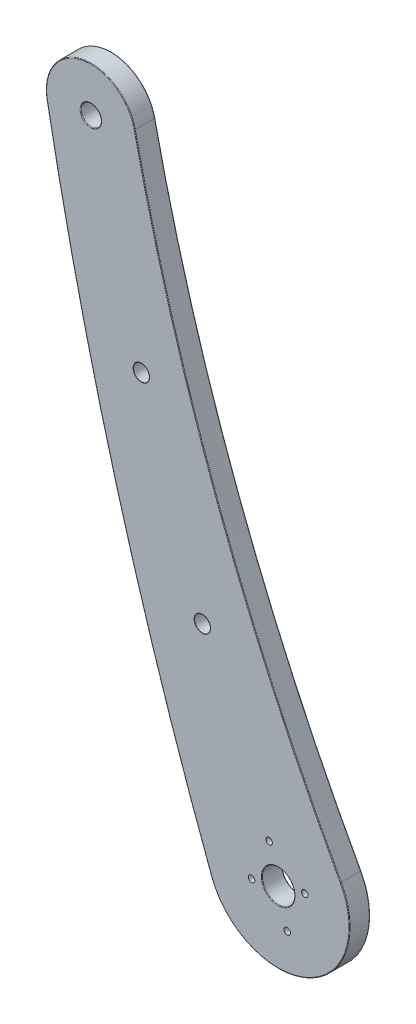
ISO-10303-21;
HEADER;
FILE_DESCRIPTION(('STEP AP214'),'2;1');
FILE_NAME('part.step','',(''),(''),'','','');
FILE_SCHEMA(('AUTOMOTIVE_DESIGN { 1 0 10303 214 1 1 1 1 }'));
ENDSEC;
DATA;
#1=APPLICATION_CONTEXT('core data for automotive mechanical design processes');
#2=APPLICATION_PROTOCOL_DEFINITION('international standard','automotive_design',2000,#1);
#3=PRODUCT_CONTEXT('',#1,'mechanical');
#4=PRODUCT('Part','Part','',(#3));
#5=PRODUCT_RELATED_PRODUCT_CATEGORY('part','',(#4));
#6=PRODUCT_DEFINITION_FORMATION('','',#4);
#7=PRODUCT_DEFINITION_CONTEXT('part definition',#1,'design');
#8=PRODUCT_DEFINITION('design','',#6,#7);
#9=PRODUCT_DEFINITION_SHAPE('','',#8);
#10=(LENGTH_UNIT() NAMED_UNIT(*) SI_UNIT(.MILLI.,.METRE.));
#11=(NAMED_UNIT(*) PLANE_ANGLE_UNIT() SI_UNIT($,.RADIAN.));
#12=(NAMED_UNIT(*) SI_UNIT($,.STERADIAN.) SOLID_ANGLE_UNIT());
#13=UNCERTAINTY_MEASURE_WITH_UNIT(LENGTH_MEASURE(1.E-05),#10,'distance_accuracy_value','');
#14=(GEOMETRIC_REPRESENTATION_CONTEXT(3) GLOBAL_UNCERTAINTY_ASSIGNED_CONTEXT((#13)) GLOBAL_UNIT_ASSIGNED_CONTEXT((#10,
#11,#12)) REPRESENTATION_CONTEXT('',''));
#15=CARTESIAN_POINT('',(0.,0.,0.));
#16=DIRECTION('',(0.,0.,1.));
#17=DIRECTION('',(1.,0.,0.));
#18=AXIS2_PLACEMENT_3D('',#15,#16,#17);
#19=CARTESIAN_POINT('',(-66.1462417472821,198.273924243267,-5.));
#20=DIRECTION('',(0.,0.,1.));
#21=DIRECTION('',(1.,0.,0.));
#22=AXIS2_PLACEMENT_3D('',#19,#20,#21);
#23=CYLINDRICAL_SURFACE('',#22,10.9999999999999);
#24=DIRECTION('',(0.,0.,1.));
#25=VECTOR('',#24,1.);
#26=CARTESIAN_POINT('',(-55.3988805782516,200.617901184795,-5.));
#27=LINE('',#26,#25);
#28=CARTESIAN_POINT('',(-55.3988805782516,200.617901184795,-4.85));
#29=VERTEX_POINT('',#28);
#30=CARTESIAN_POINT('',(-55.3988805782516,200.617901184795,-0.15));
#31=VERTEX_POINT('',#30);
#32=EDGE_CURVE('E110',#29,#31,#27,.T.);
#33=ORIENTED_EDGE('',*,*,#32,.F.);
#34=CARTESIAN_POINT('',(-66.1462417472821,198.273924243267,-4.85));
#35=DIRECTION('',(0.,0.,-1.));
#36=DIRECTION('',(-1.,0.,0.));
#37=AXIS2_PLACEMENT_3D('',#34,#35,#36);
#38=CIRCLE('',#37,10.9999999999999);
#39=CARTESIAN_POINT('',(-76.9621917027425,196.270121218771,-4.85));
#40=VERTEX_POINT('',#39);
#41=EDGE_CURVE('E105',#29,#40,#38,.F.);
#42=ORIENTED_EDGE('',*,*,#41,.T.);
#43=DIRECTION('',(0.,0.,1.));
#44=VECTOR('',#43,1.);
#45=CARTESIAN_POINT('',(-76.9621917027425,196.270121218771,-5.));
#46=LINE('',#45,#44);
#47=CARTESIAN_POINT('',(-76.9621917027425,196.270121218771,-0.15));
#48=VERTEX_POINT('',#47);
#49=EDGE_CURVE('E107',#40,#48,#46,.T.);
#50=ORIENTED_EDGE('',*,*,#49,.T.);
#51=CARTESIAN_POINT('',(-66.1462417472821,198.273924243267,-0.15));
#52=DIRECTION('',(0.,0.,-1.));
#53=DIRECTION('',(-1.,0.,0.));
#54=AXIS2_PLACEMENT_3D('',#51,#52,#53);
#55=CIRCLE('',#54,10.9999999999999);
#56=EDGE_CURVE('E116',#48,#31,#55,.T.);
#57=ORIENTED_EDGE('',*,*,#56,.T.);
#58=EDGE_LOOP('',(#33,#42,#50,#57));
#59=FACE_BOUND('',#58,.T.);
#60=ADVANCED_FACE('F39',(#59),#23,.T.);
#61=CARTESIAN_POINT('',(433.117536195866,307.162307617871,-5.));
#62=DIRECTION('',(0.,0.,1.));
#63=DIRECTION('',(1.,0.,0.));
#64=AXIS2_PLACEMENT_3D('',#61,#62,#63);
#65=CYLINDRICAL_SURFACE('',#64,500.);
#66=DIRECTION('',(0.,0.,1.));
#67=VECTOR('',#66,1.);
#68=CARTESIAN_POINT('',(-4.88974515279694,66.0199814170296,-5.));
#69=LINE('',#68,#67);
#70=CARTESIAN_POINT('',(-4.88974515279694,66.0199814170296,-4.85));
#71=VERTEX_POINT('',#70);
#72=CARTESIAN_POINT('',(-4.88974515279694,66.0199814170296,-0.15));
#73=VERTEX_POINT('',#72);
#74=EDGE_CURVE('E237',#71,#73,#69,.T.);
#75=ORIENTED_EDGE('',*,*,#74,.F.);
#76=CARTESIAN_POINT('',(433.117536195866,307.162307617871,-4.85));
#77=DIRECTION('',(0.,0.,-1.));
#78=DIRECTION('',(-1.,0.,0.));
#79=AXIS2_PLACEMENT_3D('',#76,#77,#78);
#80=CIRCLE('',#79,500.);
#81=EDGE_CURVE('E172',#71,#29,#80,.T.);
#82=ORIENTED_EDGE('',*,*,#81,.T.);
#83=ORIENTED_EDGE('',*,*,#32,.T.);
#84=CARTESIAN_POINT('',(433.117536195866,307.162307617871,-0.15));
#85=DIRECTION('',(0.,0.,-1.));
#86=DIRECTION('',(-1.,0.,0.));
#87=AXIS2_PLACEMENT_3D('',#84,#85,#86);
#88=CIRCLE('',#87,500.);
#89=EDGE_CURVE('E169',#31,#73,#88,.F.);
#90=ORIENTED_EDGE('',*,*,#89,.T.);
#91=EDGE_LOOP('',(#75,#82,#83,#90));
#92=FACE_BOUND('',#91,.T.);
#93=ADVANCED_FACE('F234',(#92),#65,.F.);
#94=CARTESIAN_POINT('',(-20.2199999999999,57.5800000000001,-5.));
#95=DIRECTION('',(0.,0.,1.));
#96=DIRECTION('',(1.,0.,0.));
#97=AXIS2_PLACEMENT_3D('',#94,#95,#96);
#98=CYLINDRICAL_SURFACE('',#97,17.5);
#99=DIRECTION('',(0.,0.,1.));
#100=VECTOR('',#99,1.);
#101=CARTESIAN_POINT('',(-36.5961270744955,51.4097113487317,-5.));
#102=LINE('',#101,#100);
#103=CARTESIAN_POINT('',(-36.5961270744955,51.4097113487317,-4.85));
#104=VERTEX_POINT('',#103);
#105=CARTESIAN_POINT('',(-36.5961270744955,51.4097113487317,-0.15));
#106=VERTEX_POINT('',#105);
#107=EDGE_CURVE('E127',#104,#106,#102,.T.);
#108=ORIENTED_EDGE('',*,*,#107,.F.);
#109=CARTESIAN_POINT('',(-20.2199999999999,57.5800000000001,-4.85));
#110=DIRECTION('',(0.,0.,-1.));
#111=DIRECTION('',(-1.,0.,0.));
#112=AXIS2_PLACEMENT_3D('',#109,#110,#111);
#113=CIRCLE('',#112,17.5);
#114=EDGE_CURVE('E167',#104,#71,#113,.F.);
#115=ORIENTED_EDGE('',*,*,#114,.T.);
#116=ORIENTED_EDGE('',*,*,#74,.T.);
#117=CARTESIAN_POINT('',(-20.2199999999999,57.5800000000001,-0.15));
#118=DIRECTION('',(0.,0.,-1.));
#119=DIRECTION('',(-1.,0.,0.));
#120=AXIS2_PLACEMENT_3D('',#117,#118,#119);
#121=CIRCLE('',#120,17.5);
#122=EDGE_CURVE('E165',#73,#106,#121,.T.);
#123=ORIENTED_EDGE('',*,*,#122,.T.);
#124=EDGE_LOOP('',(#108,#115,#116,#123));
#125=FACE_BOUND('',#124,.T.);
#126=ADVANCED_FACE('F273',(#125),#98,.T.);
#127=CARTESIAN_POINT('',(758.815759401005,351.109445838912,-5.));
#128=DIRECTION('',(0.,0.,1.));
#129=DIRECTION('',(1.,0.,0.));
#130=AXIS2_PLACEMENT_3D('',#127,#128,#129);
#131=CYLINDRICAL_SURFACE('',#130,850.);
#132=ORIENTED_EDGE('',*,*,#49,.F.);
#133=CARTESIAN_POINT('',(758.815759401005,351.109445838912,-4.85));
#134=DIRECTION('',(0.,0.,-1.));
#135=DIRECTION('',(-1.,0.,0.));
#136=AXIS2_PLACEMENT_3D('',#133,#134,#135);
#137=CIRCLE('',#136,850.);
#138=EDGE_CURVE('E123',#40,#104,#137,.F.);
#139=ORIENTED_EDGE('',*,*,#138,.T.);
#140=ORIENTED_EDGE('',*,*,#107,.T.);
#141=CARTESIAN_POINT('',(758.815759401005,351.109445838912,-0.15));
#142=DIRECTION('',(0.,0.,-1.));
#143=DIRECTION('',(-1.,0.,0.));
#144=AXIS2_PLACEMENT_3D('',#141,#142,#143);
#145=CIRCLE('',#144,850.);
#146=EDGE_CURVE('E126',#106,#48,#145,.T.);
#147=ORIENTED_EDGE('',*,*,#146,.T.);
#148=EDGE_LOOP('',(#132,#139,#140,#147));
#149=FACE_BOUND('',#148,.T.);
#150=ADVANCED_FACE('F120',(#149),#131,.T.);
#151=CARTESIAN_POINT('',(183.485647224292,252.718115930569,-5.));
#152=DIRECTION('',(0.,0.,-1.));
#153=DIRECTION('',(-1.,0.,0.));
#154=AXIS2_PLACEMENT_3D('',#151,#152,#153);
#155=PLANE('',#154);
#156=CARTESIAN_POINT('',(-17.9999472412175,49.1163207912739,-5.));
#157=DIRECTION('',(0.,0.,1.));
#158=DIRECTION('',(1.,0.,0.));
#159=AXIS2_PLACEMENT_3D('',#156,#157,#158);
#160=CIRCLE('',#159,0.8);
#161=CARTESIAN_POINT('',(-17.1999472412175,49.1163207912739,-5.));
#162=VERTEX_POINT('',#161);
#163=EDGE_CURVE('E217',#162,#162,#160,.T.);
#164=ORIENTED_EDGE('',*,*,#163,.T.);
#165=EDGE_LOOP('',(#164));
#166=FACE_BOUND('',#165,.T.);
#167=CARTESIAN_POINT('',(-13.6908760389826,59.2926121282036,-5.));
#168=DIRECTION('',(0.,0.,1.));
#169=DIRECTION('',(1.,0.,0.));
#170=AXIS2_PLACEMENT_3D('',#167,#168,#169);
#171=CIRCLE('',#170,0.800000000000001);
#172=CARTESIAN_POINT('',(-12.8908760389826,59.2926121282036,-5.));
#173=VERTEX_POINT('',#172);
#174=EDGE_CURVE('E574',#173,#173,#171,.T.);
#175=ORIENTED_EDGE('',*,*,#174,.T.);
#176=EDGE_LOOP('',(#175));
#177=FACE_BOUND('',#176,.T.);
#178=CARTESIAN_POINT('',(-22.4400527587823,66.0436792087261,-5.));
#179=DIRECTION('',(0.,0.,1.));
#180=DIRECTION('',(1.,0.,0.));
#181=AXIS2_PLACEMENT_3D('',#178,#179,#180);
#182=CIRCLE('',#181,0.799999999999994);
#183=CARTESIAN_POINT('',(-21.6400527587823,66.0436792087261,-5.));
#184=VERTEX_POINT('',#183);
#185=EDGE_CURVE('E583',#184,#184,#182,.T.);
#186=ORIENTED_EDGE('',*,*,#185,.T.);
#187=EDGE_LOOP('',(#186));
#188=FACE_BOUND('',#187,.T.);
#189=CARTESIAN_POINT('',(-26.7491239610172,55.8673878717964,-5.));
#190=DIRECTION('',(0.,0.,1.));
#191=DIRECTION('',(1.,0.,0.));
#192=AXIS2_PLACEMENT_3D('',#189,#190,#191);
#193=CIRCLE('',#192,0.800000000000006);
#194=CARTESIAN_POINT('',(-25.9491239610172,55.8673878717964,-5.));
#195=VERTEX_POINT('',#194);
#196=EDGE_CURVE('E588',#195,#195,#193,.T.);
#197=ORIENTED_EDGE('',*,*,#196,.T.);
#198=EDGE_LOOP('',(#197));
#199=FACE_BOUND('',#198,.T.);
#200=CARTESIAN_POINT('',(-20.2199999999999,57.5800000000001,-5.));
#201=DIRECTION('',(0.,0.,-1.));
#202=DIRECTION('',(-1.,0.,0.));
#203=AXIS2_PLACEMENT_3D('',#200,#201,#202);
#204=CIRCLE('',#203,17.35);
#205=CARTESIAN_POINT('',(-5.02114733720153,65.9476387191694,-5.));
#206=VERTEX_POINT('',#205);
#207=CARTESIAN_POINT('',(-36.4557602709999,51.4625995371712,-5.));
#208=VERTEX_POINT('',#207);
#209=EDGE_CURVE('E161',#206,#208,#204,.T.);
#210=ORIENTED_EDGE('',*,*,#209,.T.);
#211=CARTESIAN_POINT('',(758.815759401005,351.109445838912,-5.));
#212=DIRECTION('',(0.,0.,-1.));
#213=DIRECTION('',(-1.,0.,0.));
#214=AXIS2_PLACEMENT_3D('',#211,#212,#213);
#215=CIRCLE('',#214,849.85);
#216=CARTESIAN_POINT('',(-76.8147014760769,196.297445805469,-5.));
#217=VERTEX_POINT('',#216);
#218=EDGE_CURVE('E163',#208,#217,#215,.T.);
#219=ORIENTED_EDGE('',*,*,#218,.T.);
#220=CARTESIAN_POINT('',(-66.1462417472821,198.273924243267,-5.));
#221=DIRECTION('',(0.,0.,-1.));
#222=DIRECTION('',(-1.,0.,0.));
#223=AXIS2_PLACEMENT_3D('',#220,#221,#222);
#224=CIRCLE('',#223,10.8499999999999);
#225=CARTESIAN_POINT('',(-55.5454355032839,200.585937862865,-5.));
#226=VERTEX_POINT('',#225);
#227=EDGE_CURVE('E133',#217,#226,#224,.T.);
#228=ORIENTED_EDGE('',*,*,#227,.T.);
#229=CARTESIAN_POINT('',(433.117536195866,307.162307617871,-5.));
#230=DIRECTION('',(0.,0.,-1.));
#231=DIRECTION('',(-1.,0.,0.));
#232=AXIS2_PLACEMENT_3D('',#229,#230,#231);
#233=CIRCLE('',#232,500.15);
#234=EDGE_CURVE('E159',#226,#206,#233,.F.);
#235=ORIENTED_EDGE('',*,*,#234,.T.);
#236=EDGE_LOOP('',(#210,#219,#228,#235));
#237=FACE_BOUND('',#236,.T.);
#238=CARTESIAN_POINT('',(-66.1462417472821,198.273924243267,-5.));
#239=DIRECTION('',(0.,0.,-1.));
#240=DIRECTION('',(-1.,0.,0.));
#241=AXIS2_PLACEMENT_3D('',#238,#239,#240);
#242=CIRCLE('',#241,2.65000000000001);
#243=CARTESIAN_POINT('',(-68.7962417472821,198.273924243267,-5.));
#244=VERTEX_POINT('',#243);
#245=EDGE_CURVE('E155',#244,#244,#242,.F.);
#246=ORIENTED_EDGE('',*,*,#245,.T.);
#247=EDGE_LOOP('',(#246));
#248=FACE_BOUND('',#247,.T.);
#249=CARTESIAN_POINT('',(-20.22,57.5800000000001,-5.));
#250=DIRECTION('',(0.,0.,-1.));
#251=DIRECTION('',(-1.,0.,0.));
#252=AXIS2_PLACEMENT_3D('',#249,#250,#251);
#253=CIRCLE('',#252,4.15);
#254=CARTESIAN_POINT('',(-24.37,57.5800000000001,-5.));
#255=VERTEX_POINT('',#254);
#256=EDGE_CURVE('E152',#255,#255,#253,.F.);
#257=ORIENTED_EDGE('',*,*,#256,.T.);
#258=EDGE_LOOP('',(#257));
#259=FACE_BOUND('',#258,.T.);
#260=CARTESIAN_POINT('',(-38.8128946370687,103.994483397048,-5.));
#261=DIRECTION('',(0.,0.,-1.));
#262=DIRECTION('',(-1.,0.,0.));
#263=AXIS2_PLACEMENT_3D('',#260,#261,#262);
#264=CIRCLE('',#263,2.09999999999999);
#265=CARTESIAN_POINT('',(-40.9128946370687,103.994483397048,-5.));
#266=VERTEX_POINT('',#265);
#267=EDGE_CURVE('E146',#266,#266,#264,.F.);
#268=ORIENTED_EDGE('',*,*,#267,.T.);
#269=EDGE_LOOP('',(#268));
#270=FACE_BOUND('',#269,.T.);
#271=CARTESIAN_POINT('',(-53.7744095936375,149.828720464544,-5.));
#272=DIRECTION('',(0.,0.,-1.));
#273=DIRECTION('',(-1.,0.,0.));
#274=AXIS2_PLACEMENT_3D('',#271,#272,#273);
#275=CIRCLE('',#274,2.09999999999999);
#276=CARTESIAN_POINT('',(-55.8744095936375,149.828720464544,-5.));
#277=VERTEX_POINT('',#276);
#278=EDGE_CURVE('E143',#277,#277,#275,.F.);
#279=ORIENTED_EDGE('',*,*,#278,.T.);
#280=EDGE_LOOP('',(#279));
#281=FACE_BOUND('',#280,.T.);
#282=ADVANCED_FACE('F246',(#166,#177,#188,#199,#237,#248,#259,#270,#281),#155,.T.);
#283=CARTESIAN_POINT('',(183.485647224292,252.718115930569,0.));
#284=DIRECTION('',(0.,0.,-1.));
#285=DIRECTION('',(-1.,0.,0.));
#286=AXIS2_PLACEMENT_3D('',#283,#284,#285);
#287=PLANE('',#286);
#288=CARTESIAN_POINT('',(-17.9999472412175,49.1163207912739,0.));
#289=DIRECTION('',(0.,0.,1.));
#290=DIRECTION('',(1.,0.,0.));
#291=AXIS2_PLACEMENT_3D('',#288,#289,#290);
#292=CIRCLE('',#291,0.8);
#293=CARTESIAN_POINT('',(-17.1999472412175,49.1163207912739,0.));
#294=VERTEX_POINT('',#293);
#295=EDGE_CURVE('E573',#294,#294,#292,.T.);
#296=ORIENTED_EDGE('',*,*,#295,.F.);
#297=EDGE_LOOP('',(#296));
#298=FACE_BOUND('',#297,.T.);
#299=CARTESIAN_POINT('',(-13.6908760389826,59.2926121282036,0.));
#300=DIRECTION('',(0.,0.,1.));
#301=DIRECTION('',(1.,0.,0.));
#302=AXIS2_PLACEMENT_3D('',#299,#300,#301);
#303=CIRCLE('',#302,0.800000000000001);
#304=CARTESIAN_POINT('',(-12.8908760389826,59.2926121282036,0.));
#305=VERTEX_POINT('',#304);
#306=EDGE_CURVE('E578',#305,#305,#303,.T.);
#307=ORIENTED_EDGE('',*,*,#306,.F.);
#308=EDGE_LOOP('',(#307));
#309=FACE_BOUND('',#308,.T.);
#310=CARTESIAN_POINT('',(-22.4400527587823,66.0436792087261,0.));
#311=DIRECTION('',(0.,0.,1.));
#312=DIRECTION('',(1.,0.,0.));
#313=AXIS2_PLACEMENT_3D('',#310,#311,#312);
#314=CIRCLE('',#313,0.799999999999994);
#315=CARTESIAN_POINT('',(-21.6400527587823,66.0436792087261,0.));
#316=VERTEX_POINT('',#315);
#317=EDGE_CURVE('E586',#316,#316,#314,.T.);
#318=ORIENTED_EDGE('',*,*,#317,.F.);
#319=EDGE_LOOP('',(#318));
#320=FACE_BOUND('',#319,.T.);
#321=CARTESIAN_POINT('',(-26.7491239610172,55.8673878717964,0.));
#322=DIRECTION('',(0.,0.,1.));
#323=DIRECTION('',(1.,0.,0.));
#324=AXIS2_PLACEMENT_3D('',#321,#322,#323);
#325=CIRCLE('',#324,0.800000000000006);
#326=CARTESIAN_POINT('',(-25.9491239610172,55.8673878717964,0.));
#327=VERTEX_POINT('',#326);
#328=EDGE_CURVE('E268',#327,#327,#325,.T.);
#329=ORIENTED_EDGE('',*,*,#328,.F.);
#330=EDGE_LOOP('',(#329));
#331=FACE_BOUND('',#330,.T.);
#332=CARTESIAN_POINT('',(-20.2199999999999,57.5800000000001,0.));
#333=DIRECTION('',(0.,0.,-1.));
#334=DIRECTION('',(-1.,0.,0.));
#335=AXIS2_PLACEMENT_3D('',#332,#333,#334);
#336=CIRCLE('',#335,17.35);
#337=CARTESIAN_POINT('',(-36.4557602710001,51.4625995371711,0.));
#338=VERTEX_POINT('',#337);
#339=CARTESIAN_POINT('',(-5.02114733720134,65.9476387191695,0.));
#340=VERTEX_POINT('',#339);
#341=EDGE_CURVE('E48',#338,#340,#336,.F.);
#342=ORIENTED_EDGE('',*,*,#341,.T.);
#343=CARTESIAN_POINT('',(433.117536195866,307.162307617871,0.));
#344=DIRECTION('',(0.,0.,-1.));
#345=DIRECTION('',(-1.,0.,0.));
#346=AXIS2_PLACEMENT_3D('',#343,#344,#345);
#347=CIRCLE('',#346,500.15);
#348=CARTESIAN_POINT('',(-55.5454355032839,200.585937862865,0.));
#349=VERTEX_POINT('',#348);
#350=EDGE_CURVE('E11',#340,#349,#347,.T.);
#351=ORIENTED_EDGE('',*,*,#350,.T.);
#352=CARTESIAN_POINT('',(-66.1462417472821,198.273924243267,0.));
#353=DIRECTION('',(0.,0.,-1.));
#354=DIRECTION('',(-1.,0.,0.));
#355=AXIS2_PLACEMENT_3D('',#352,#353,#354);
#356=CIRCLE('',#355,10.8499999999999);
#357=CARTESIAN_POINT('',(-76.8147014760769,196.297445805469,0.));
#358=VERTEX_POINT('',#357);
#359=EDGE_CURVE('E204',#349,#358,#356,.F.);
#360=ORIENTED_EDGE('',*,*,#359,.T.);
#361=CARTESIAN_POINT('',(758.815759401005,351.109445838912,0.));
#362=DIRECTION('',(0.,0.,-1.));
#363=DIRECTION('',(-1.,0.,0.));
#364=AXIS2_PLACEMENT_3D('',#361,#362,#363);
#365=CIRCLE('',#364,849.85);
#366=EDGE_CURVE('E59',#358,#338,#365,.F.);
#367=ORIENTED_EDGE('',*,*,#366,.T.);
#368=EDGE_LOOP('',(#342,#351,#360,#367));
#369=FACE_BOUND('',#368,.T.);
#370=CARTESIAN_POINT('',(-66.1462417472821,198.273924243267,0.));
#371=DIRECTION('',(0.,0.,-1.));
#372=DIRECTION('',(-1.,0.,0.));
#373=AXIS2_PLACEMENT_3D('',#370,#371,#372);
#374=CIRCLE('',#373,2.65000000000001);
#375=CARTESIAN_POINT('',(-68.7962417472821,198.273924243267,0.));
#376=VERTEX_POINT('',#375);
#377=EDGE_CURVE('E201',#376,#376,#374,.T.);
#378=ORIENTED_EDGE('',*,*,#377,.T.);
#379=EDGE_LOOP('',(#378));
#380=FACE_BOUND('',#379,.T.);
#381=CARTESIAN_POINT('',(-20.22,57.5800000000001,0.));
#382=DIRECTION('',(0.,0.,-1.));
#383=DIRECTION('',(-1.,0.,0.));
#384=AXIS2_PLACEMENT_3D('',#381,#382,#383);
#385=CIRCLE('',#384,4.15);
#386=CARTESIAN_POINT('',(-24.37,57.5800000000001,0.));
#387=VERTEX_POINT('',#386);
#388=EDGE_CURVE('E198',#387,#387,#385,.T.);
#389=ORIENTED_EDGE('',*,*,#388,.T.);
#390=EDGE_LOOP('',(#389));
#391=FACE_BOUND('',#390,.T.);
#392=CARTESIAN_POINT('',(-38.8128946370687,103.994483397048,0.));
#393=DIRECTION('',(0.,0.,-1.));
#394=DIRECTION('',(-1.,0.,0.));
#395=AXIS2_PLACEMENT_3D('',#392,#393,#394);
#396=CIRCLE('',#395,2.03291561975889);
#397=CARTESIAN_POINT('',(-40.8458102568276,103.994483397048,0.));
#398=VERTEX_POINT('',#397);
#399=EDGE_CURVE('E195',#398,#398,#396,.T.);
#400=ORIENTED_EDGE('',*,*,#399,.T.);
#401=EDGE_LOOP('',(#400));
#402=FACE_BOUND('',#401,.T.);
#403=CARTESIAN_POINT('',(-53.7744095936375,149.828720464544,0.));
#404=DIRECTION('',(0.,0.,-1.));
#405=DIRECTION('',(-1.,0.,0.));
#406=AXIS2_PLACEMENT_3D('',#403,#404,#405);
#407=CIRCLE('',#406,2.03291561975889);
#408=CARTESIAN_POINT('',(-55.8073252133964,149.828720464544,0.));
#409=VERTEX_POINT('',#408);
#410=EDGE_CURVE('E192',#409,#409,#407,.T.);
#411=ORIENTED_EDGE('',*,*,#410,.T.);
#412=EDGE_LOOP('',(#411));
#413=FACE_BOUND('',#412,.T.);
#414=ADVANCED_FACE('F242',(#298,#309,#320,#331,#369,#380,#391,#402,#413),#287,.F.);
#415=CARTESIAN_POINT('',(-66.1462417472821,198.273924243267,-5.));
#416=DIRECTION('',(0.,0.,1.));
#417=DIRECTION('',(1.,0.,0.));
#418=AXIS2_PLACEMENT_3D('',#415,#416,#417);
#419=CYLINDRICAL_SURFACE('',#418,2.50000000000001);
#420=CARTESIAN_POINT('',(-66.1462417472821,198.273924243267,-4.85));
#421=DIRECTION('',(0.,0.,-1.));
#422=DIRECTION('',(-1.,0.,0.));
#423=AXIS2_PLACEMENT_3D('',#420,#421,#422);
#424=CIRCLE('',#423,2.50000000000001);
#425=CARTESIAN_POINT('',(-68.6462417472821,198.273924243267,-4.85));
#426=VERTEX_POINT('',#425);
#427=EDGE_CURVE('E177',#426,#426,#424,.T.);
#428=ORIENTED_EDGE('',*,*,#427,.T.);
#429=EDGE_LOOP('',(#428));
#430=FACE_BOUND('',#429,.T.);
#431=CARTESIAN_POINT('',(-66.1462417472821,198.273924243267,-0.15));
#432=DIRECTION('',(0.,0.,-1.));
#433=DIRECTION('',(-1.,0.,0.));
#434=AXIS2_PLACEMENT_3D('',#431,#432,#433);
#435=CIRCLE('',#434,2.50000000000001);
#436=CARTESIAN_POINT('',(-68.6462417472821,198.273924243267,-0.15));
#437=VERTEX_POINT('',#436);
#438=EDGE_CURVE('E115',#437,#437,#435,.F.);
#439=ORIENTED_EDGE('',*,*,#438,.T.);
#440=EDGE_LOOP('',(#439));
#441=FACE_BOUND('',#440,.T.);
#442=ADVANCED_FACE('F245',(#430,#441),#419,.F.);
#443=CARTESIAN_POINT('',(-20.22,57.5800000000001,-5.));
#444=DIRECTION('',(0.,0.,1.));
#445=DIRECTION('',(1.,0.,0.));
#446=AXIS2_PLACEMENT_3D('',#443,#444,#445);
#447=CYLINDRICAL_SURFACE('',#446,4.);
#448=CARTESIAN_POINT('',(-20.22,57.5800000000001,-4.85));
#449=DIRECTION('',(0.,0.,-1.));
#450=DIRECTION('',(-1.,0.,0.));
#451=AXIS2_PLACEMENT_3D('',#448,#449,#450);
#452=CIRCLE('',#451,4.);
#453=CARTESIAN_POINT('',(-24.22,57.5800000000001,-4.85));
#454=VERTEX_POINT('',#453);
#455=EDGE_CURVE('E183',#454,#454,#452,.T.);
#456=ORIENTED_EDGE('',*,*,#455,.T.);
#457=EDGE_LOOP('',(#456));
#458=FACE_BOUND('',#457,.T.);
#459=CARTESIAN_POINT('',(-20.22,57.5800000000001,-0.15));
#460=DIRECTION('',(0.,0.,-1.));
#461=DIRECTION('',(-1.,0.,0.));
#462=AXIS2_PLACEMENT_3D('',#459,#460,#461);
#463=CIRCLE('',#462,4.);
#464=CARTESIAN_POINT('',(-24.22,57.5800000000001,-0.15));
#465=VERTEX_POINT('',#464);
#466=EDGE_CURVE('E180',#465,#465,#463,.F.);
#467=ORIENTED_EDGE('',*,*,#466,.T.);
#468=EDGE_LOOP('',(#467));
#469=FACE_BOUND('',#468,.T.);
#470=ADVANCED_FACE('F310',(#458,#469),#447,.F.);
#471=CARTESIAN_POINT('',(-38.8128946370687,103.994483397048,0.));
#472=DIRECTION('',(0.,0.,1.));
#473=DIRECTION('',(1.,0.,0.));
#474=AXIS2_PLACEMENT_3D('',#471,#472,#473);
#475=CYLINDRICAL_SURFACE('',#474,1.94999999999999);
#476=CARTESIAN_POINT('',(-38.8128946370687,103.994483397048,-4.85));
#477=DIRECTION('',(0.,0.,-1.));
#478=DIRECTION('',(-1.,0.,0.));
#479=AXIS2_PLACEMENT_3D('',#476,#477,#478);
#480=CIRCLE('',#479,1.94999999999999);
#481=CARTESIAN_POINT('',(-40.7628946370687,103.994483397048,-4.85));
#482=VERTEX_POINT('',#481);
#483=EDGE_CURVE('E186',#482,#482,#480,.T.);
#484=ORIENTED_EDGE('',*,*,#483,.T.);
#485=EDGE_LOOP('',(#484));
#486=FACE_BOUND('',#485,.T.);
#487=CARTESIAN_POINT('',(-38.8128946370687,103.994483397048,-0.0250000000000007));
#488=DIRECTION('',(0.,0.,1.));
#489=DIRECTION('',(1.,0.,0.));
#490=AXIS2_PLACEMENT_3D('',#487,#488,#489);
#491=CIRCLE('',#490,1.95);
#492=CARTESIAN_POINT('',(-36.8628946370687,103.994483397048,-0.0250000000000007));
#493=VERTEX_POINT('',#492);
#494=EDGE_CURVE('E128',#493,#493,#491,.T.);
#495=ORIENTED_EDGE('',*,*,#494,.T.);
#496=EDGE_LOOP('',(#495));
#497=FACE_BOUND('',#496,.T.);
#498=ADVANCED_FACE('F303',(#486,#497),#475,.F.);
#499=CARTESIAN_POINT('',(-53.7744095936375,149.828720464544,0.));
#500=DIRECTION('',(0.,0.,1.));
#501=DIRECTION('',(1.,0.,0.));
#502=AXIS2_PLACEMENT_3D('',#499,#500,#501);
#503=CYLINDRICAL_SURFACE('',#502,1.94999999999999);
#504=CARTESIAN_POINT('',(-53.7744095936375,149.828720464544,-4.85));
#505=DIRECTION('',(0.,0.,-1.));
#506=DIRECTION('',(-1.,0.,0.));
#507=AXIS2_PLACEMENT_3D('',#504,#505,#506);
#508=CIRCLE('',#507,1.94999999999999);
#509=CARTESIAN_POINT('',(-55.7244095936375,149.828720464544,-4.85));
#510=VERTEX_POINT('',#509);
#511=EDGE_CURVE('E189',#510,#510,#508,.T.);
#512=ORIENTED_EDGE('',*,*,#511,.T.);
#513=EDGE_LOOP('',(#512));
#514=FACE_BOUND('',#513,.T.);
#515=CARTESIAN_POINT('',(-53.7744095936375,149.828720464544,-0.0250000000000007));
#516=DIRECTION('',(0.,0.,1.));
#517=DIRECTION('',(1.,0.,0.));
#518=AXIS2_PLACEMENT_3D('',#515,#516,#517);
#519=CIRCLE('',#518,1.95);
#520=CARTESIAN_POINT('',(-51.8244095936375,149.828720464544,-0.0250000000000007));
#521=VERTEX_POINT('',#520);
#522=EDGE_CURVE('E213',#521,#521,#519,.T.);
#523=ORIENTED_EDGE('',*,*,#522,.T.);
#524=EDGE_LOOP('',(#523));
#525=FACE_BOUND('',#524,.T.);
#526=ADVANCED_FACE('F301',(#514,#525),#503,.F.);
#527=CARTESIAN_POINT('',(433.117536195866,307.162307617871,-4.85));
#528=DIRECTION('',(0.,0.,-1.));
#529=DIRECTION('',(-1.,0.,0.));
#530=AXIS2_PLACEMENT_3D('',#527,#528,#529);
#531=TOROIDAL_SURFACE('',#530,500.15,0.15);
#532=CARTESIAN_POINT('',(-5.02114733720153,65.9476387191694,-4.85));
#533=DIRECTION('',(0.482284652401714,-0.876014562697309,0.));
#534=DIRECTION('',(0.87601456269731,0.482284652401714,0.));
#535=AXIS2_PLACEMENT_3D('',#532,#533,#534);
#536=CIRCLE('',#535,0.15);
#537=EDGE_CURVE('E137',#206,#71,#536,.T.);
#538=ORIENTED_EDGE('',*,*,#537,.F.);
#539=ORIENTED_EDGE('',*,*,#234,.F.);
#540=CARTESIAN_POINT('',(-55.5454355032839,200.585937862865,-4.85));
#541=DIRECTION('',(-0.21308881286615,0.977032833548236,0.));
#542=DIRECTION('',(-0.977032833548236,-0.21308881286615,0.));
#543=AXIS2_PLACEMENT_3D('',#540,#541,#542);
#544=CIRCLE('',#543,0.15);
#545=EDGE_CURVE('E211',#29,#226,#544,.T.);
#546=ORIENTED_EDGE('',*,*,#545,.F.);
#547=ORIENTED_EDGE('',*,*,#81,.F.);
#548=EDGE_LOOP('',(#538,#539,#546,#547));
#549=FACE_BOUND('',#548,.T.);
#550=ADVANCED_FACE('F276',(#549),#531,.T.);
#551=CARTESIAN_POINT('',(-66.1462417472821,198.273924243267,-4.85));
#552=DIRECTION('',(0.,0.,-1.));
#553=DIRECTION('',(-1.,0.,0.));
#554=AXIS2_PLACEMENT_3D('',#551,#552,#553);
#555=TOROIDAL_SURFACE('',#554,10.8499999999999,0.15);
#556=ORIENTED_EDGE('',*,*,#545,.T.);
#557=ORIENTED_EDGE('',*,*,#227,.F.);
#558=CARTESIAN_POINT('',(-76.8147014760769,196.297445805469,-4.85));
#559=DIRECTION('',(0.182163911317723,-0.983268177769132,-1.81941161723419E-13));
#560=DIRECTION('',(0.983268177769132,0.182163911317723,0.));
#561=AXIS2_PLACEMENT_3D('',#558,#559,#560);
#562=CIRCLE('',#561,0.15);
#563=EDGE_CURVE('E131',#40,#217,#562,.T.);
#564=ORIENTED_EDGE('',*,*,#563,.F.);
#565=ORIENTED_EDGE('',*,*,#41,.F.);
#566=EDGE_LOOP('',(#556,#557,#564,#565));
#567=FACE_BOUND('',#566,.T.);
#568=ADVANCED_FACE('F132',(#567),#555,.T.);
#569=CARTESIAN_POINT('',(-20.2199999999999,57.5800000000001,-4.85));
#570=DIRECTION('',(0.,0.,-1.));
#571=DIRECTION('',(-1.,0.,0.));
#572=AXIS2_PLACEMENT_3D('',#569,#570,#571);
#573=TOROIDAL_SURFACE('',#572,17.35,0.15);
#574=ORIENTED_EDGE('',*,*,#537,.T.);
#575=ORIENTED_EDGE('',*,*,#114,.F.);
#576=CARTESIAN_POINT('',(-36.4557602709999,51.4625995371712,-4.85));
#577=DIRECTION('',(-0.352587922929622,0.935778689971178,0.));
#578=DIRECTION('',(-0.935778689971178,-0.352587922929622,0.));
#579=AXIS2_PLACEMENT_3D('',#576,#577,#578);
#580=CIRCLE('',#579,0.15);
#581=EDGE_CURVE('E138',#208,#104,#580,.T.);
#582=ORIENTED_EDGE('',*,*,#581,.F.);
#583=ORIENTED_EDGE('',*,*,#209,.F.);
#584=EDGE_LOOP('',(#574,#575,#582,#583));
#585=FACE_BOUND('',#584,.T.);
#586=ADVANCED_FACE('F280',(#585),#573,.T.);
#587=CARTESIAN_POINT('',(758.815759401005,351.109445838912,-4.85));
#588=DIRECTION('',(0.,0.,-1.));
#589=DIRECTION('',(-1.,0.,0.));
#590=AXIS2_PLACEMENT_3D('',#587,#588,#589);
#591=TOROIDAL_SURFACE('',#590,849.85,0.15);
#592=ORIENTED_EDGE('',*,*,#563,.T.);
#593=ORIENTED_EDGE('',*,*,#218,.F.);
#594=ORIENTED_EDGE('',*,*,#581,.T.);
#595=ORIENTED_EDGE('',*,*,#138,.F.);
#596=EDGE_LOOP('',(#592,#593,#594,#595));
#597=FACE_BOUND('',#596,.T.);
#598=ADVANCED_FACE('F140',(#597),#591,.T.);
#599=CARTESIAN_POINT('',(-66.1462417472821,198.273924243267,-4.85));
#600=DIRECTION('',(0.,0.,-1.));
#601=DIRECTION('',(-1.,0.,0.));
#602=AXIS2_PLACEMENT_3D('',#599,#600,#601);
#603=TOROIDAL_SURFACE('',#602,2.65000000000001,0.15);
#604=ORIENTED_EDGE('',*,*,#427,.F.);
#605=EDGE_LOOP('',(#604));
#606=FACE_BOUND('',#605,.T.);
#607=ORIENTED_EDGE('',*,*,#245,.F.);
#608=EDGE_LOOP('',(#607));
#609=FACE_BOUND('',#608,.T.);
#610=ADVANCED_FACE('F325',(#606,#609),#603,.T.);
#611=CARTESIAN_POINT('',(-20.22,57.5800000000001,-4.85));
#612=DIRECTION('',(0.,0.,-1.));
#613=DIRECTION('',(-1.,0.,0.));
#614=AXIS2_PLACEMENT_3D('',#611,#612,#613);
#615=TOROIDAL_SURFACE('',#614,4.15,0.15);
#616=ORIENTED_EDGE('',*,*,#455,.F.);
#617=EDGE_LOOP('',(#616));
#618=FACE_BOUND('',#617,.T.);
#619=ORIENTED_EDGE('',*,*,#256,.F.);
#620=EDGE_LOOP('',(#619));
#621=FACE_BOUND('',#620,.T.);
#622=ADVANCED_FACE('F332',(#618,#621),#615,.T.);
#623=CARTESIAN_POINT('',(-38.8128946370687,103.994483397048,-4.85));
#624=DIRECTION('',(0.,0.,-1.));
#625=DIRECTION('',(-1.,0.,0.));
#626=AXIS2_PLACEMENT_3D('',#623,#624,#625);
#627=TOROIDAL_SURFACE('',#626,2.09999999999999,0.15);
#628=ORIENTED_EDGE('',*,*,#267,.F.);
#629=EDGE_LOOP('',(#628));
#630=FACE_BOUND('',#629,.T.);
#631=ORIENTED_EDGE('',*,*,#483,.F.);
#632=EDGE_LOOP('',(#631));
#633=FACE_BOUND('',#632,.T.);
#634=ADVANCED_FACE('F297',(#630,#633),#627,.T.);
#635=CARTESIAN_POINT('',(-53.7744095936375,149.828720464544,-4.85));
#636=DIRECTION('',(0.,0.,-1.));
#637=DIRECTION('',(-1.,0.,0.));
#638=AXIS2_PLACEMENT_3D('',#635,#636,#637);
#639=TOROIDAL_SURFACE('',#638,2.09999999999999,0.15);
#640=ORIENTED_EDGE('',*,*,#278,.F.);
#641=EDGE_LOOP('',(#640));
#642=FACE_BOUND('',#641,.T.);
#643=ORIENTED_EDGE('',*,*,#511,.F.);
#644=EDGE_LOOP('',(#643));
#645=FACE_BOUND('',#644,.T.);
#646=ADVANCED_FACE('F294',(#642,#645),#639,.T.);
#647=CARTESIAN_POINT('',(758.815759401005,351.109445838912,-0.15));
#648=DIRECTION('',(0.,0.,-1.));
#649=DIRECTION('',(-1.,0.,0.));
#650=AXIS2_PLACEMENT_3D('',#647,#648,#649);
#651=TOROIDAL_SURFACE('',#650,849.85,0.15);
#652=CARTESIAN_POINT('',(-76.8147014760772,196.297445805469,-0.15));
#653=DIRECTION('',(-0.182163911317902,0.983268177769099,0.));
#654=DIRECTION('',(-0.983268177769099,-0.182163911317902,0.));
#655=AXIS2_PLACEMENT_3D('',#652,#653,#654);
#656=CIRCLE('',#655,0.15);
#657=EDGE_CURVE('E218',#48,#358,#656,.T.);
#658=ORIENTED_EDGE('',*,*,#657,.F.);
#659=ORIENTED_EDGE('',*,*,#146,.F.);
#660=CARTESIAN_POINT('',(-36.4557602710001,51.4625995371711,-0.15));
#661=DIRECTION('',(0.352587922929664,-0.935778689971163,0.));
#662=DIRECTION('',(0.935778689971163,0.352587922929664,0.));
#663=AXIS2_PLACEMENT_3D('',#660,#661,#662);
#664=CIRCLE('',#663,0.15);
#665=EDGE_CURVE('E43',#338,#106,#664,.T.);
#666=ORIENTED_EDGE('',*,*,#665,.F.);
#667=ORIENTED_EDGE('',*,*,#366,.F.);
#668=EDGE_LOOP('',(#658,#659,#666,#667));
#669=FACE_BOUND('',#668,.T.);
#670=ADVANCED_FACE('F228',(#669),#651,.T.);
#671=CARTESIAN_POINT('',(-20.2199999999999,57.5800000000001,-0.15));
#672=DIRECTION('',(0.,0.,-1.));
#673=DIRECTION('',(-1.,0.,0.));
#674=AXIS2_PLACEMENT_3D('',#671,#672,#673);
#675=TOROIDAL_SURFACE('',#674,17.35,0.15);
#676=ORIENTED_EDGE('',*,*,#665,.T.);
#677=ORIENTED_EDGE('',*,*,#122,.F.);
#678=CARTESIAN_POINT('',(-5.02114733720134,65.9476387191695,-0.15));
#679=DIRECTION('',(-0.482284652401714,0.876014562697309,0.));
#680=DIRECTION('',(-0.876014562697309,-0.482284652401714,0.));
#681=AXIS2_PLACEMENT_3D('',#678,#679,#680);
#682=CIRCLE('',#681,0.15);
#683=EDGE_CURVE('E216',#340,#73,#682,.T.);
#684=ORIENTED_EDGE('',*,*,#683,.F.);
#685=ORIENTED_EDGE('',*,*,#341,.F.);
#686=EDGE_LOOP('',(#676,#677,#684,#685));
#687=FACE_BOUND('',#686,.T.);
#688=ADVANCED_FACE('F226',(#687),#675,.T.);
#689=CARTESIAN_POINT('',(-66.1462417472821,198.273924243267,-0.15));
#690=DIRECTION('',(0.,0.,-1.));
#691=DIRECTION('',(-1.,0.,0.));
#692=AXIS2_PLACEMENT_3D('',#689,#690,#691);
#693=TOROIDAL_SURFACE('',#692,10.8499999999999,0.15);
#694=ORIENTED_EDGE('',*,*,#657,.T.);
#695=ORIENTED_EDGE('',*,*,#359,.F.);
#696=CARTESIAN_POINT('',(-55.5454355032839,200.585937862865,-0.15));
#697=DIRECTION('',(0.213088812866159,-0.977032833548234,0.));
#698=DIRECTION('',(0.977032833548234,0.213088812866159,0.));
#699=AXIS2_PLACEMENT_3D('',#696,#697,#698);
#700=CIRCLE('',#699,0.15);
#701=EDGE_CURVE('E214',#31,#349,#700,.T.);
#702=ORIENTED_EDGE('',*,*,#701,.F.);
#703=ORIENTED_EDGE('',*,*,#56,.F.);
#704=EDGE_LOOP('',(#694,#695,#702,#703));
#705=FACE_BOUND('',#704,.T.);
#706=ADVANCED_FACE('F230',(#705),#693,.T.);
#707=CARTESIAN_POINT('',(433.117536195866,307.162307617871,-0.15));
#708=DIRECTION('',(0.,0.,-1.));
#709=DIRECTION('',(-1.,0.,0.));
#710=AXIS2_PLACEMENT_3D('',#707,#708,#709);
#711=TOROIDAL_SURFACE('',#710,500.15,0.15);
#712=ORIENTED_EDGE('',*,*,#683,.T.);
#713=ORIENTED_EDGE('',*,*,#89,.F.);
#714=ORIENTED_EDGE('',*,*,#701,.T.);
#715=ORIENTED_EDGE('',*,*,#350,.F.);
#716=EDGE_LOOP('',(#712,#713,#714,#715));
#717=FACE_BOUND('',#716,.T.);
#718=ADVANCED_FACE('F240',(#717),#711,.T.);
#719=CARTESIAN_POINT('',(-66.1462417472821,198.273924243267,-0.15));
#720=DIRECTION('',(0.,0.,-1.));
#721=DIRECTION('',(-1.,0.,0.));
#722=AXIS2_PLACEMENT_3D('',#719,#720,#721);
#723=TOROIDAL_SURFACE('',#722,2.65000000000001,0.15);
#724=ORIENTED_EDGE('',*,*,#377,.F.);
#725=EDGE_LOOP('',(#724));
#726=FACE_BOUND('',#725,.T.);
#727=ORIENTED_EDGE('',*,*,#438,.F.);
#728=EDGE_LOOP('',(#727));
#729=FACE_BOUND('',#728,.T.);
#730=ADVANCED_FACE('F342',(#726,#729),#723,.T.);
#731=CARTESIAN_POINT('',(-20.22,57.5800000000001,-0.15));
#732=DIRECTION('',(0.,0.,-1.));
#733=DIRECTION('',(-1.,0.,0.));
#734=AXIS2_PLACEMENT_3D('',#731,#732,#733);
#735=TOROIDAL_SURFACE('',#734,4.15,0.15);
#736=ORIENTED_EDGE('',*,*,#388,.F.);
#737=EDGE_LOOP('',(#736));
#738=FACE_BOUND('',#737,.T.);
#739=ORIENTED_EDGE('',*,*,#466,.F.);
#740=EDGE_LOOP('',(#739));
#741=FACE_BOUND('',#740,.T.);
#742=ADVANCED_FACE('F351',(#738,#741),#735,.T.);
#743=CARTESIAN_POINT('',(-38.8128946370687,103.994483397048,-0.15));
#744=DIRECTION('',(0.,0.,-1.));
#745=DIRECTION('',(-1.,0.,0.));
#746=AXIS2_PLACEMENT_3D('',#743,#744,#745);
#747=TOROIDAL_SURFACE('',#746,2.03291561975889,0.15);
#748=ORIENTED_EDGE('',*,*,#399,.F.);
#749=EDGE_LOOP('',(#748));
#750=FACE_BOUND('',#749,.T.);
#751=ORIENTED_EDGE('',*,*,#494,.F.);
#752=EDGE_LOOP('',(#751));
#753=FACE_BOUND('',#752,.T.);
#754=ADVANCED_FACE('F260',(#750,#753),#747,.T.);
#755=CARTESIAN_POINT('',(-53.7744095936375,149.828720464544,-0.15));
#756=DIRECTION('',(0.,0.,-1.));
#757=DIRECTION('',(-1.,0.,0.));
#758=AXIS2_PLACEMENT_3D('',#755,#756,#757);
#759=TOROIDAL_SURFACE('',#758,2.03291561975889,0.15);
#760=ORIENTED_EDGE('',*,*,#410,.F.);
#761=EDGE_LOOP('',(#760));
#762=FACE_BOUND('',#761,.T.);
#763=ORIENTED_EDGE('',*,*,#522,.F.);
#764=EDGE_LOOP('',(#763));
#765=FACE_BOUND('',#764,.T.);
#766=ADVANCED_FACE('F41',(#762,#765),#759,.T.);
#767=CARTESIAN_POINT('',(-26.7491239610172,55.8673878717964,-5.));
#768=DIRECTION('',(0.,0.,1.));
#769=DIRECTION('',(1.,0.,0.));
#770=AXIS2_PLACEMENT_3D('',#767,#768,#769);
#771=CYLINDRICAL_SURFACE('',#770,0.800000000000006);
#772=ORIENTED_EDGE('',*,*,#196,.F.);
#773=EDGE_LOOP('',(#772));
#774=FACE_BOUND('',#773,.T.);
#775=ORIENTED_EDGE('',*,*,#328,.T.);
#776=EDGE_LOOP('',(#775));
#777=FACE_BOUND('',#776,.T.);
#778=ADVANCED_FACE('F259',(#774,#777),#771,.F.);
#779=CARTESIAN_POINT('',(-22.4400527587823,66.0436792087261,-5.));
#780=DIRECTION('',(0.,0.,1.));
#781=DIRECTION('',(1.,0.,0.));
#782=AXIS2_PLACEMENT_3D('',#779,#780,#781);
#783=CYLINDRICAL_SURFACE('',#782,0.799999999999994);
#784=ORIENTED_EDGE('',*,*,#185,.F.);
#785=EDGE_LOOP('',(#784));
#786=FACE_BOUND('',#785,.T.);
#787=ORIENTED_EDGE('',*,*,#317,.T.);
#788=EDGE_LOOP('',(#787));
#789=FACE_BOUND('',#788,.T.);
#790=ADVANCED_FACE('F388',(#786,#789),#783,.F.);
#791=CARTESIAN_POINT('',(-13.6908760389826,59.2926121282036,-5.));
#792=DIRECTION('',(0.,0.,1.));
#793=DIRECTION('',(1.,0.,0.));
#794=AXIS2_PLACEMENT_3D('',#791,#792,#793);
#795=CYLINDRICAL_SURFACE('',#794,0.800000000000001);
#796=ORIENTED_EDGE('',*,*,#174,.F.);
#797=EDGE_LOOP('',(#796));
#798=FACE_BOUND('',#797,.T.);
#799=ORIENTED_EDGE('',*,*,#306,.T.);
#800=EDGE_LOOP('',(#799));
#801=FACE_BOUND('',#800,.T.);
#802=ADVANCED_FACE('F396',(#798,#801),#795,.F.);
#803=CARTESIAN_POINT('',(-17.9999472412175,49.1163207912739,-5.));
#804=DIRECTION('',(0.,0.,1.));
#805=DIRECTION('',(1.,0.,0.));
#806=AXIS2_PLACEMENT_3D('',#803,#804,#805);
#807=CYLINDRICAL_SURFACE('',#806,0.8);
#808=ORIENTED_EDGE('',*,*,#163,.F.);
#809=EDGE_LOOP('',(#808));
#810=FACE_BOUND('',#809,.T.);
#811=ORIENTED_EDGE('',*,*,#295,.T.);
#812=EDGE_LOOP('',(#811));
#813=FACE_BOUND('',#812,.T.);
#814=ADVANCED_FACE('F405',(#810,#813),#807,.F.);
#815=CLOSED_SHELL('',(#60,#93,#126,#150,#282,#414,#442,#470,#498,#526,#550,#568,#586,#598,#610,
#622,#634,#646,#670,#688,#706,#718,#730,#742,#754,#766,#778,#790,#802,#814));
#816=MANIFOLD_SOLID_BREP('B2',#815);
#817=ADVANCED_BREP_SHAPE_REPRESENTATION('',(#18,#816),#14);
#818=SHAPE_DEFINITION_REPRESENTATION(#9,#817);
ENDSEC;
END-ISO-10303-21;
